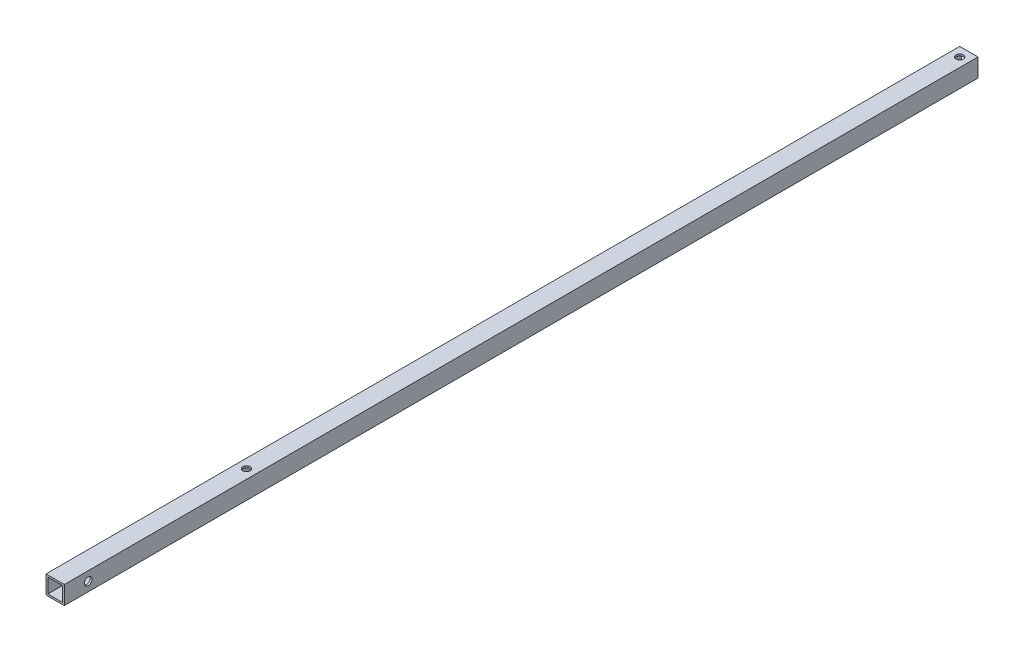
ISO-10303-21;
HEADER;
FILE_DESCRIPTION(('STEP AP214'),'2;1');
FILE_NAME('part.step','',(''),(''),'','','');
FILE_SCHEMA(('AUTOMOTIVE_DESIGN { 1 0 10303 214 1 1 1 1 }'));
ENDSEC;
DATA;
#1=APPLICATION_CONTEXT('core data for automotive mechanical design processes');
#2=APPLICATION_PROTOCOL_DEFINITION('international standard','automotive_design',2000,#1);
#3=PRODUCT_CONTEXT('',#1,'mechanical');
#4=PRODUCT('Part','Part','',(#3));
#5=PRODUCT_RELATED_PRODUCT_CATEGORY('part','',(#4));
#6=PRODUCT_DEFINITION_FORMATION('','',#4);
#7=PRODUCT_DEFINITION_CONTEXT('part definition',#1,'design');
#8=PRODUCT_DEFINITION('design','',#6,#7);
#9=PRODUCT_DEFINITION_SHAPE('','',#8);
#10=(LENGTH_UNIT() NAMED_UNIT(*) SI_UNIT(.MILLI.,.METRE.));
#11=(NAMED_UNIT(*) PLANE_ANGLE_UNIT() SI_UNIT($,.RADIAN.));
#12=(NAMED_UNIT(*) SI_UNIT($,.STERADIAN.) SOLID_ANGLE_UNIT());
#13=UNCERTAINTY_MEASURE_WITH_UNIT(LENGTH_MEASURE(1.E-05),#10,'distance_accuracy_value','');
#14=(GEOMETRIC_REPRESENTATION_CONTEXT(3) GLOBAL_UNCERTAINTY_ASSIGNED_CONTEXT((#13)) GLOBAL_UNIT_ASSIGNED_CONTEXT((#10,
#11,#12)) REPRESENTATION_CONTEXT('',''));
#15=CARTESIAN_POINT('',(0.,0.,0.));
#16=DIRECTION('',(0.,0.,1.));
#17=DIRECTION('',(1.,0.,0.));
#18=AXIS2_PLACEMENT_3D('',#15,#16,#17);
#19=CARTESIAN_POINT('',(0.,0.,499.));
#20=DIRECTION('',(0.,0.,1.));
#21=DIRECTION('',(1.,0.,0.));
#22=AXIS2_PLACEMENT_3D('',#19,#20,#21);
#23=PLANE('',#22);
#24=DIRECTION('',(0.,1.,0.));
#25=VECTOR('',#24,1.);
#26=CARTESIAN_POINT('',(5.,-5.,499.));
#27=LINE('',#26,#25);
#28=CARTESIAN_POINT('',(5.,-5.,499.));
#29=VERTEX_POINT('',#28);
#30=CARTESIAN_POINT('',(5.,5.,499.));
#31=VERTEX_POINT('',#30);
#32=EDGE_CURVE('E166',#29,#31,#27,.T.);
#33=ORIENTED_EDGE('',*,*,#32,.T.);
#34=DIRECTION('',(-1.,0.,0.));
#35=VECTOR('',#34,1.);
#36=CARTESIAN_POINT('',(-5.,5.,499.));
#37=LINE('',#36,#35);
#38=CARTESIAN_POINT('',(-5.,5.,499.));
#39=VERTEX_POINT('',#38);
#40=EDGE_CURVE('E169',#31,#39,#37,.T.);
#41=ORIENTED_EDGE('',*,*,#40,.T.);
#42=DIRECTION('',(0.,-1.,0.));
#43=VECTOR('',#42,1.);
#44=CARTESIAN_POINT('',(-5.,-5.,499.));
#45=LINE('',#44,#43);
#46=CARTESIAN_POINT('',(-5.,-5.,499.));
#47=VERTEX_POINT('',#46);
#48=EDGE_CURVE('E172',#39,#47,#45,.T.);
#49=ORIENTED_EDGE('',*,*,#48,.T.);
#50=DIRECTION('',(1.,0.,0.));
#51=VECTOR('',#50,1.);
#52=CARTESIAN_POINT('',(-5.,-5.,499.));
#53=LINE('',#52,#51);
#54=EDGE_CURVE('E174',#47,#29,#53,.T.);
#55=ORIENTED_EDGE('',*,*,#54,.T.);
#56=EDGE_LOOP('',(#33,#41,#49,#55));
#57=FACE_BOUND('',#56,.T.);
#58=DIRECTION('',(-1.,0.,0.));
#59=VECTOR('',#58,1.);
#60=CARTESIAN_POINT('',(0.,4.,499.));
#61=LINE('',#60,#59);
#62=CARTESIAN_POINT('',(4.,4.,499.));
#63=VERTEX_POINT('',#62);
#64=CARTESIAN_POINT('',(-4.,4.,499.));
#65=VERTEX_POINT('',#64);
#66=EDGE_CURVE('E136',#63,#65,#61,.T.);
#67=ORIENTED_EDGE('',*,*,#66,.F.);
#68=DIRECTION('',(0.,1.,0.));
#69=VECTOR('',#68,1.);
#70=CARTESIAN_POINT('',(4.,0.,499.));
#71=LINE('',#70,#69);
#72=CARTESIAN_POINT('',(4.,-4.,499.));
#73=VERTEX_POINT('',#72);
#74=EDGE_CURVE('E128',#73,#63,#71,.T.);
#75=ORIENTED_EDGE('',*,*,#74,.F.);
#76=DIRECTION('',(1.,0.,0.));
#77=VECTOR('',#76,1.);
#78=CARTESIAN_POINT('',(0.,-4.,499.));
#79=LINE('',#78,#77);
#80=CARTESIAN_POINT('',(-4.,-4.,499.));
#81=VERTEX_POINT('',#80);
#82=EDGE_CURVE('E150',#81,#73,#79,.T.);
#83=ORIENTED_EDGE('',*,*,#82,.F.);
#84=DIRECTION('',(0.,-1.,0.));
#85=VECTOR('',#84,1.);
#86=CARTESIAN_POINT('',(-4.,0.,499.));
#87=LINE('',#86,#85);
#88=EDGE_CURVE('E148',#65,#81,#87,.T.);
#89=ORIENTED_EDGE('',*,*,#88,.F.);
#90=EDGE_LOOP('',(#67,#75,#83,#89));
#91=FACE_BOUND('',#90,.T.);
#92=ADVANCED_FACE('F61',(#57,#91),#23,.T.);
#93=CARTESIAN_POINT('',(0.,0.,0.));
#94=DIRECTION('',(0.,0.,1.));
#95=DIRECTION('',(1.,0.,0.));
#96=AXIS2_PLACEMENT_3D('',#93,#94,#95);
#97=PLANE('',#96);
#98=DIRECTION('',(0.,1.,0.));
#99=VECTOR('',#98,1.);
#100=CARTESIAN_POINT('',(5.,-5.,0.));
#101=LINE('',#100,#99);
#102=CARTESIAN_POINT('',(5.,-5.,0.));
#103=VERTEX_POINT('',#102);
#104=CARTESIAN_POINT('',(5.,5.,0.));
#105=VERTEX_POINT('',#104);
#106=EDGE_CURVE('E144',#103,#105,#101,.T.);
#107=ORIENTED_EDGE('',*,*,#106,.F.);
#108=DIRECTION('',(1.,0.,0.));
#109=VECTOR('',#108,1.);
#110=CARTESIAN_POINT('',(-5.,-5.,0.));
#111=LINE('',#110,#109);
#112=CARTESIAN_POINT('',(-5.,-5.,0.));
#113=VERTEX_POINT('',#112);
#114=EDGE_CURVE('E170',#113,#103,#111,.T.);
#115=ORIENTED_EDGE('',*,*,#114,.F.);
#116=DIRECTION('',(0.,-1.,0.));
#117=VECTOR('',#116,1.);
#118=CARTESIAN_POINT('',(-5.,-5.,0.));
#119=LINE('',#118,#117);
#120=CARTESIAN_POINT('',(-5.,5.,0.));
#121=VERTEX_POINT('',#120);
#122=EDGE_CURVE('E181',#121,#113,#119,.T.);
#123=ORIENTED_EDGE('',*,*,#122,.F.);
#124=DIRECTION('',(-1.,0.,0.));
#125=VECTOR('',#124,1.);
#126=CARTESIAN_POINT('',(-5.,5.,0.));
#127=LINE('',#126,#125);
#128=EDGE_CURVE('E179',#105,#121,#127,.T.);
#129=ORIENTED_EDGE('',*,*,#128,.F.);
#130=EDGE_LOOP('',(#107,#115,#123,#129));
#131=FACE_BOUND('',#130,.T.);
#132=DIRECTION('',(0.,1.,0.));
#133=VECTOR('',#132,1.);
#134=CARTESIAN_POINT('',(4.,0.,0.));
#135=LINE('',#134,#133);
#136=CARTESIAN_POINT('',(4.,-4.,0.));
#137=VERTEX_POINT('',#136);
#138=CARTESIAN_POINT('',(4.,4.,0.));
#139=VERTEX_POINT('',#138);
#140=EDGE_CURVE('E86',#137,#139,#135,.T.);
#141=ORIENTED_EDGE('',*,*,#140,.T.);
#142=DIRECTION('',(-1.,0.,0.));
#143=VECTOR('',#142,1.);
#144=CARTESIAN_POINT('',(0.,4.,0.));
#145=LINE('',#144,#143);
#146=CARTESIAN_POINT('',(-4.,4.,0.));
#147=VERTEX_POINT('',#146);
#148=EDGE_CURVE('E143',#139,#147,#145,.T.);
#149=ORIENTED_EDGE('',*,*,#148,.T.);
#150=DIRECTION('',(0.,-1.,0.));
#151=VECTOR('',#150,1.);
#152=CARTESIAN_POINT('',(-4.,0.,0.));
#153=LINE('',#152,#151);
#154=CARTESIAN_POINT('',(-4.,-4.,0.));
#155=VERTEX_POINT('',#154);
#156=EDGE_CURVE('E158',#147,#155,#153,.T.);
#157=ORIENTED_EDGE('',*,*,#156,.T.);
#158=DIRECTION('',(1.,0.,0.));
#159=VECTOR('',#158,1.);
#160=CARTESIAN_POINT('',(0.,-4.,0.));
#161=LINE('',#160,#159);
#162=EDGE_CURVE('E137',#155,#137,#161,.T.);
#163=ORIENTED_EDGE('',*,*,#162,.T.);
#164=EDGE_LOOP('',(#141,#149,#157,#163));
#165=FACE_BOUND('',#164,.T.);
#166=ADVANCED_FACE('F239',(#131,#165),#97,.F.);
#167=CARTESIAN_POINT('',(5.,-5.,499.));
#168=DIRECTION('',(-1.,0.,0.));
#169=DIRECTION('',(0.,0.,1.));
#170=AXIS2_PLACEMENT_3D('',#167,#168,#169);
#171=PLANE('',#170);
#172=CARTESIAN_POINT('',(5.,0.,485.96));
#173=DIRECTION('',(1.,0.,0.));
#174=DIRECTION('',(0.,0.,-1.));
#175=AXIS2_PLACEMENT_3D('',#172,#173,#174);
#176=CIRCLE('',#175,2.09999999999999);
#177=CARTESIAN_POINT('',(5.,0.,483.86));
#178=VERTEX_POINT('',#177);
#179=EDGE_CURVE('E219',#178,#178,#176,.T.);
#180=ORIENTED_EDGE('',*,*,#179,.F.);
#181=EDGE_LOOP('',(#180));
#182=FACE_BOUND('',#181,.T.);
#183=ORIENTED_EDGE('',*,*,#106,.T.);
#184=DIRECTION('',(0.,0.,-1.));
#185=VECTOR('',#184,1.);
#186=CARTESIAN_POINT('',(5.,5.,499.));
#187=LINE('',#186,#185);
#188=EDGE_CURVE('E12',#31,#105,#187,.T.);
#189=ORIENTED_EDGE('',*,*,#188,.F.);
#190=ORIENTED_EDGE('',*,*,#32,.F.);
#191=DIRECTION('',(0.,0.,-1.));
#192=VECTOR('',#191,1.);
#193=CARTESIAN_POINT('',(5.,-5.,499.));
#194=LINE('',#193,#192);
#195=EDGE_CURVE('E176',#29,#103,#194,.T.);
#196=ORIENTED_EDGE('',*,*,#195,.T.);
#197=EDGE_LOOP('',(#183,#189,#190,#196));
#198=FACE_BOUND('',#197,.T.);
#199=ADVANCED_FACE('F63',(#182,#198),#171,.F.);
#200=CARTESIAN_POINT('',(-5.,5.,499.));
#201=DIRECTION('',(0.,-1.,0.));
#202=DIRECTION('',(0.,0.,-1.));
#203=AXIS2_PLACEMENT_3D('',#200,#201,#202);
#204=PLANE('',#203);
#205=CARTESIAN_POINT('',(0.,5.,5.));
#206=DIRECTION('',(0.,1.,0.));
#207=DIRECTION('',(0.,0.,1.));
#208=AXIS2_PLACEMENT_3D('',#205,#206,#207);
#209=CIRCLE('',#208,2.);
#210=CARTESIAN_POINT('',(0.,5.,7.));
#211=VERTEX_POINT('',#210);
#212=EDGE_CURVE('E212',#211,#211,#209,.T.);
#213=ORIENTED_EDGE('',*,*,#212,.F.);
#214=EDGE_LOOP('',(#213));
#215=FACE_BOUND('',#214,.T.);
#216=CARTESIAN_POINT('',(0.,5.,394.5));
#217=DIRECTION('',(0.,1.,0.));
#218=DIRECTION('',(0.,0.,1.));
#219=AXIS2_PLACEMENT_3D('',#216,#217,#218);
#220=CIRCLE('',#219,2.);
#221=CARTESIAN_POINT('',(0.,5.,396.5));
#222=VERTEX_POINT('',#221);
#223=EDGE_CURVE('E205',#222,#222,#220,.T.);
#224=ORIENTED_EDGE('',*,*,#223,.F.);
#225=EDGE_LOOP('',(#224));
#226=FACE_BOUND('',#225,.T.);
#227=ORIENTED_EDGE('',*,*,#128,.T.);
#228=DIRECTION('',(0.,0.,-1.));
#229=VECTOR('',#228,1.);
#230=CARTESIAN_POINT('',(-5.,5.,499.));
#231=LINE('',#230,#229);
#232=EDGE_CURVE('E70',#39,#121,#231,.T.);
#233=ORIENTED_EDGE('',*,*,#232,.F.);
#234=ORIENTED_EDGE('',*,*,#40,.F.);
#235=ORIENTED_EDGE('',*,*,#188,.T.);
#236=EDGE_LOOP('',(#227,#233,#234,#235));
#237=FACE_BOUND('',#236,.T.);
#238=ADVANCED_FACE('F269',(#215,#226,#237),#204,.F.);
#239=CARTESIAN_POINT('',(-5.,-5.,499.));
#240=DIRECTION('',(1.,0.,0.));
#241=DIRECTION('',(0.,0.,-1.));
#242=AXIS2_PLACEMENT_3D('',#239,#240,#241);
#243=PLANE('',#242);
#244=CARTESIAN_POINT('',(-5.,0.,485.96));
#245=DIRECTION('',(1.,0.,0.));
#246=DIRECTION('',(0.,0.,-1.));
#247=AXIS2_PLACEMENT_3D('',#244,#245,#246);
#248=CIRCLE('',#247,2.09999999999999);
#249=CARTESIAN_POINT('',(-5.,0.,483.86));
#250=VERTEX_POINT('',#249);
#251=EDGE_CURVE('E222',#250,#250,#248,.T.);
#252=ORIENTED_EDGE('',*,*,#251,.T.);
#253=EDGE_LOOP('',(#252));
#254=FACE_BOUND('',#253,.T.);
#255=ORIENTED_EDGE('',*,*,#122,.T.);
#256=DIRECTION('',(0.,0.,-1.));
#257=VECTOR('',#256,1.);
#258=CARTESIAN_POINT('',(-5.,-5.,499.));
#259=LINE('',#258,#257);
#260=EDGE_CURVE('E186',#47,#113,#259,.T.);
#261=ORIENTED_EDGE('',*,*,#260,.F.);
#262=ORIENTED_EDGE('',*,*,#48,.F.);
#263=ORIENTED_EDGE('',*,*,#232,.T.);
#264=EDGE_LOOP('',(#255,#261,#262,#263));
#265=FACE_BOUND('',#264,.T.);
#266=ADVANCED_FACE('F266',(#254,#265),#243,.F.);
#267=CARTESIAN_POINT('',(-5.,-5.,499.));
#268=DIRECTION('',(0.,1.,0.));
#269=DIRECTION('',(0.,0.,1.));
#270=AXIS2_PLACEMENT_3D('',#267,#268,#269);
#271=PLANE('',#270);
#272=CARTESIAN_POINT('',(0.,-5.,5.));
#273=DIRECTION('',(0.,1.,0.));
#274=DIRECTION('',(0.,0.,1.));
#275=AXIS2_PLACEMENT_3D('',#272,#273,#274);
#276=CIRCLE('',#275,2.);
#277=CARTESIAN_POINT('',(0.,-5.,7.));
#278=VERTEX_POINT('',#277);
#279=EDGE_CURVE('E194',#278,#278,#276,.T.);
#280=ORIENTED_EDGE('',*,*,#279,.T.);
#281=EDGE_LOOP('',(#280));
#282=FACE_BOUND('',#281,.T.);
#283=CARTESIAN_POINT('',(0.,-5.,394.5));
#284=DIRECTION('',(0.,1.,0.));
#285=DIRECTION('',(0.,0.,1.));
#286=AXIS2_PLACEMENT_3D('',#283,#284,#285);
#287=CIRCLE('',#286,2.);
#288=CARTESIAN_POINT('',(0.,-5.,396.5));
#289=VERTEX_POINT('',#288);
#290=EDGE_CURVE('E208',#289,#289,#287,.T.);
#291=ORIENTED_EDGE('',*,*,#290,.T.);
#292=EDGE_LOOP('',(#291));
#293=FACE_BOUND('',#292,.T.);
#294=ORIENTED_EDGE('',*,*,#114,.T.);
#295=ORIENTED_EDGE('',*,*,#195,.F.);
#296=ORIENTED_EDGE('',*,*,#54,.F.);
#297=ORIENTED_EDGE('',*,*,#260,.T.);
#298=EDGE_LOOP('',(#294,#295,#296,#297));
#299=FACE_BOUND('',#298,.T.);
#300=ADVANCED_FACE('F263',(#282,#293,#299),#271,.F.);
#301=CARTESIAN_POINT('',(4.,0.,499.));
#302=DIRECTION('',(-1.,0.,0.));
#303=DIRECTION('',(0.,0.,1.));
#304=AXIS2_PLACEMENT_3D('',#301,#302,#303);
#305=PLANE('',#304);
#306=CARTESIAN_POINT('',(4.,0.,485.96));
#307=DIRECTION('',(-1.,0.,0.));
#308=DIRECTION('',(0.,0.,1.));
#309=AXIS2_PLACEMENT_3D('',#306,#307,#308);
#310=CIRCLE('',#309,2.09999999999999);
#311=CARTESIAN_POINT('',(4.,0.,488.06));
#312=VERTEX_POINT('',#311);
#313=EDGE_CURVE('E209',#312,#312,#310,.T.);
#314=ORIENTED_EDGE('',*,*,#313,.F.);
#315=EDGE_LOOP('',(#314));
#316=FACE_BOUND('',#315,.T.);
#317=ORIENTED_EDGE('',*,*,#140,.F.);
#318=DIRECTION('',(0.,0.,-1.));
#319=VECTOR('',#318,1.);
#320=CARTESIAN_POINT('',(4.,-4.,499.));
#321=LINE('',#320,#319);
#322=EDGE_CURVE('E132',#73,#137,#321,.T.);
#323=ORIENTED_EDGE('',*,*,#322,.F.);
#324=ORIENTED_EDGE('',*,*,#74,.T.);
#325=DIRECTION('',(0.,0.,-1.));
#326=VECTOR('',#325,1.);
#327=CARTESIAN_POINT('',(4.,4.,499.));
#328=LINE('',#327,#326);
#329=EDGE_CURVE('E131',#63,#139,#328,.T.);
#330=ORIENTED_EDGE('',*,*,#329,.T.);
#331=EDGE_LOOP('',(#317,#323,#324,#330));
#332=FACE_BOUND('',#331,.T.);
#333=ADVANCED_FACE('F130',(#316,#332),#305,.T.);
#334=CARTESIAN_POINT('',(0.,4.,499.));
#335=DIRECTION('',(0.,-1.,0.));
#336=DIRECTION('',(0.,0.,-1.));
#337=AXIS2_PLACEMENT_3D('',#334,#335,#336);
#338=PLANE('',#337);
#339=CARTESIAN_POINT('',(0.,4.,5.));
#340=DIRECTION('',(0.,-1.,0.));
#341=DIRECTION('',(0.,0.,-1.));
#342=AXIS2_PLACEMENT_3D('',#339,#340,#341);
#343=CIRCLE('',#342,2.);
#344=CARTESIAN_POINT('',(0.,4.,3.));
#345=VERTEX_POINT('',#344);
#346=EDGE_CURVE('E156',#345,#345,#343,.T.);
#347=ORIENTED_EDGE('',*,*,#346,.F.);
#348=EDGE_LOOP('',(#347));
#349=FACE_BOUND('',#348,.T.);
#350=CARTESIAN_POINT('',(0.,4.,394.5));
#351=DIRECTION('',(0.,-1.,0.));
#352=DIRECTION('',(0.,0.,-1.));
#353=AXIS2_PLACEMENT_3D('',#350,#351,#352);
#354=CIRCLE('',#353,2.);
#355=CARTESIAN_POINT('',(0.,4.,392.5));
#356=VERTEX_POINT('',#355);
#357=EDGE_CURVE('E193',#356,#356,#354,.T.);
#358=ORIENTED_EDGE('',*,*,#357,.F.);
#359=EDGE_LOOP('',(#358));
#360=FACE_BOUND('',#359,.T.);
#361=ORIENTED_EDGE('',*,*,#148,.F.);
#362=ORIENTED_EDGE('',*,*,#329,.F.);
#363=ORIENTED_EDGE('',*,*,#66,.T.);
#364=DIRECTION('',(0.,0.,-1.));
#365=VECTOR('',#364,1.);
#366=CARTESIAN_POINT('',(-4.,4.,499.));
#367=LINE('',#366,#365);
#368=EDGE_CURVE('E145',#65,#147,#367,.T.);
#369=ORIENTED_EDGE('',*,*,#368,.T.);
#370=EDGE_LOOP('',(#361,#362,#363,#369));
#371=FACE_BOUND('',#370,.T.);
#372=ADVANCED_FACE('F140',(#349,#360,#371),#338,.T.);
#373=CARTESIAN_POINT('',(-4.,0.,499.));
#374=DIRECTION('',(1.,0.,0.));
#375=DIRECTION('',(0.,0.,-1.));
#376=AXIS2_PLACEMENT_3D('',#373,#374,#375);
#377=PLANE('',#376);
#378=CARTESIAN_POINT('',(-4.,0.,485.96));
#379=DIRECTION('',(1.,0.,0.));
#380=DIRECTION('',(0.,0.,-1.));
#381=AXIS2_PLACEMENT_3D('',#378,#379,#380);
#382=CIRCLE('',#381,2.09999999999999);
#383=CARTESIAN_POINT('',(-4.,0.,483.86));
#384=VERTEX_POINT('',#383);
#385=EDGE_CURVE('E65',#384,#384,#382,.T.);
#386=ORIENTED_EDGE('',*,*,#385,.F.);
#387=EDGE_LOOP('',(#386));
#388=FACE_BOUND('',#387,.T.);
#389=ORIENTED_EDGE('',*,*,#156,.F.);
#390=ORIENTED_EDGE('',*,*,#368,.F.);
#391=ORIENTED_EDGE('',*,*,#88,.T.);
#392=DIRECTION('',(0.,0.,-1.));
#393=VECTOR('',#392,1.);
#394=CARTESIAN_POINT('',(-4.,-4.,499.));
#395=LINE('',#394,#393);
#396=EDGE_CURVE('E78',#81,#155,#395,.T.);
#397=ORIENTED_EDGE('',*,*,#396,.T.);
#398=EDGE_LOOP('',(#389,#390,#391,#397));
#399=FACE_BOUND('',#398,.T.);
#400=ADVANCED_FACE('F232',(#388,#399),#377,.T.);
#401=CARTESIAN_POINT('',(0.,-4.,499.));
#402=DIRECTION('',(0.,1.,0.));
#403=DIRECTION('',(0.,0.,1.));
#404=AXIS2_PLACEMENT_3D('',#401,#402,#403);
#405=PLANE('',#404);
#406=CARTESIAN_POINT('',(0.,-4.,5.));
#407=DIRECTION('',(0.,1.,0.));
#408=DIRECTION('',(0.,0.,1.));
#409=AXIS2_PLACEMENT_3D('',#406,#407,#408);
#410=CIRCLE('',#409,2.);
#411=CARTESIAN_POINT('',(0.,-4.,7.));
#412=VERTEX_POINT('',#411);
#413=EDGE_CURVE('E195',#412,#412,#410,.T.);
#414=ORIENTED_EDGE('',*,*,#413,.F.);
#415=EDGE_LOOP('',(#414));
#416=FACE_BOUND('',#415,.T.);
#417=CARTESIAN_POINT('',(0.,-4.,394.5));
#418=DIRECTION('',(0.,1.,0.));
#419=DIRECTION('',(0.,0.,1.));
#420=AXIS2_PLACEMENT_3D('',#417,#418,#419);
#421=CIRCLE('',#420,2.);
#422=CARTESIAN_POINT('',(0.,-4.,396.5));
#423=VERTEX_POINT('',#422);
#424=EDGE_CURVE('E191',#423,#423,#421,.T.);
#425=ORIENTED_EDGE('',*,*,#424,.F.);
#426=EDGE_LOOP('',(#425));
#427=FACE_BOUND('',#426,.T.);
#428=ORIENTED_EDGE('',*,*,#162,.F.);
#429=ORIENTED_EDGE('',*,*,#396,.F.);
#430=ORIENTED_EDGE('',*,*,#82,.T.);
#431=ORIENTED_EDGE('',*,*,#322,.T.);
#432=EDGE_LOOP('',(#428,#429,#430,#431));
#433=FACE_BOUND('',#432,.T.);
#434=ADVANCED_FACE('F235',(#416,#427,#433),#405,.T.);
#435=CARTESIAN_POINT('',(0.,-5.,394.5));
#436=DIRECTION('',(0.,1.,0.));
#437=DIRECTION('',(0.,0.,1.));
#438=AXIS2_PLACEMENT_3D('',#435,#436,#437);
#439=CYLINDRICAL_SURFACE('',#438,2.);
#440=ORIENTED_EDGE('',*,*,#424,.T.);
#441=EDGE_LOOP('',(#440));
#442=FACE_BOUND('',#441,.T.);
#443=ORIENTED_EDGE('',*,*,#290,.F.);
#444=EDGE_LOOP('',(#443));
#445=FACE_BOUND('',#444,.T.);
#446=ADVANCED_FACE('F241',(#442,#445),#439,.F.);
#447=CARTESIAN_POINT('',(0.,-5.,5.));
#448=DIRECTION('',(0.,1.,0.));
#449=DIRECTION('',(0.,0.,1.));
#450=AXIS2_PLACEMENT_3D('',#447,#448,#449);
#451=CYLINDRICAL_SURFACE('',#450,2.);
#452=ORIENTED_EDGE('',*,*,#413,.T.);
#453=EDGE_LOOP('',(#452));
#454=FACE_BOUND('',#453,.T.);
#455=ORIENTED_EDGE('',*,*,#279,.F.);
#456=EDGE_LOOP('',(#455));
#457=FACE_BOUND('',#456,.T.);
#458=ADVANCED_FACE('F247',(#454,#457),#451,.F.);
#459=ORIENTED_EDGE('',*,*,#357,.T.);
#460=EDGE_LOOP('',(#459));
#461=FACE_BOUND('',#460,.T.);
#462=ORIENTED_EDGE('',*,*,#223,.T.);
#463=EDGE_LOOP('',(#462));
#464=FACE_BOUND('',#463,.T.);
#465=ADVANCED_FACE('F250',(#461,#464),#439,.F.);
#466=ORIENTED_EDGE('',*,*,#346,.T.);
#467=EDGE_LOOP('',(#466));
#468=FACE_BOUND('',#467,.T.);
#469=ORIENTED_EDGE('',*,*,#212,.T.);
#470=EDGE_LOOP('',(#469));
#471=FACE_BOUND('',#470,.T.);
#472=ADVANCED_FACE('F295',(#468,#471),#451,.F.);
#473=CARTESIAN_POINT('',(-5.,0.,485.96));
#474=DIRECTION('',(1.,0.,0.));
#475=DIRECTION('',(0.,0.,-1.));
#476=AXIS2_PLACEMENT_3D('',#473,#474,#475);
#477=CYLINDRICAL_SURFACE('',#476,2.09999999999999);
#478=ORIENTED_EDGE('',*,*,#385,.T.);
#479=EDGE_LOOP('',(#478));
#480=FACE_BOUND('',#479,.T.);
#481=ORIENTED_EDGE('',*,*,#251,.F.);
#482=EDGE_LOOP('',(#481));
#483=FACE_BOUND('',#482,.T.);
#484=ADVANCED_FACE('F229',(#480,#483),#477,.F.);
#485=ORIENTED_EDGE('',*,*,#313,.T.);
#486=EDGE_LOOP('',(#485));
#487=FACE_BOUND('',#486,.T.);
#488=ORIENTED_EDGE('',*,*,#179,.T.);
#489=EDGE_LOOP('',(#488));
#490=FACE_BOUND('',#489,.T.);
#491=ADVANCED_FACE('F304',(#487,#490),#477,.F.);
#492=CLOSED_SHELL('',(#92,#166,#199,#238,#266,#300,#333,#372,#400,#434,#446,#458,#465,#472,#484,#491));
#493=MANIFOLD_SOLID_BREP('B2',#492);
#494=ADVANCED_BREP_SHAPE_REPRESENTATION('',(#18,#493),#14);
#495=SHAPE_DEFINITION_REPRESENTATION(#9,#494);
ENDSEC;
END-ISO-10303-21;
